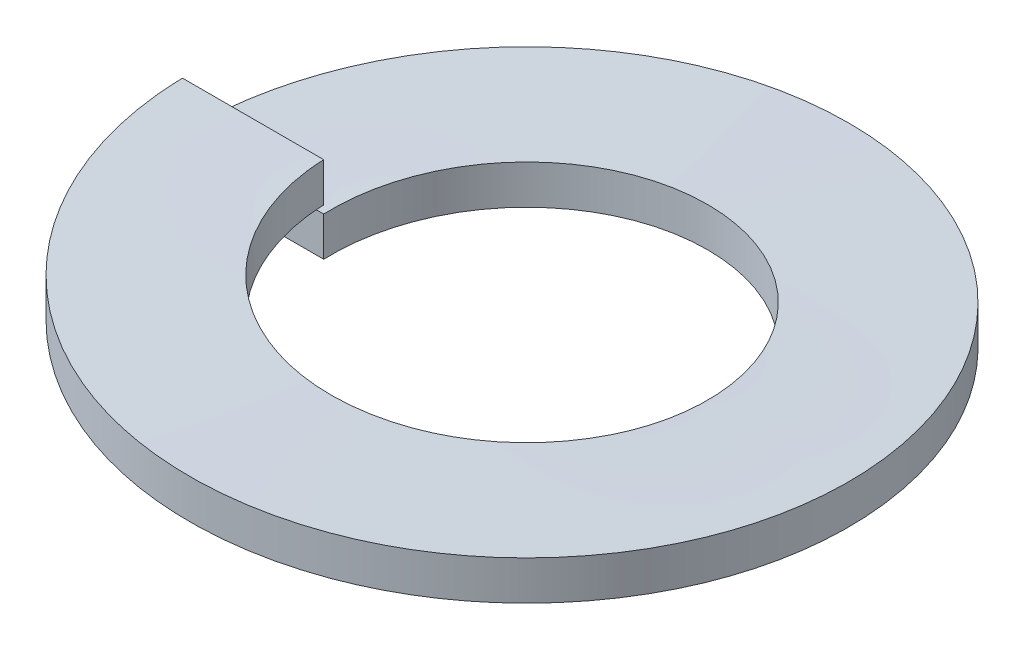
ISO-10303-21;
HEADER;
FILE_DESCRIPTION(('STEP AP214'),'2;1');
FILE_NAME('part.step','',(''),(''),'','','');
FILE_SCHEMA(('AUTOMOTIVE_DESIGN { 1 0 10303 214 1 1 1 1 }'));
ENDSEC;
DATA;
#1=APPLICATION_CONTEXT('core data for automotive mechanical design processes');
#2=APPLICATION_PROTOCOL_DEFINITION('international standard','automotive_design',2000,#1);
#3=PRODUCT_CONTEXT('',#1,'mechanical');
#4=PRODUCT('Part','Part','',(#3));
#5=PRODUCT_RELATED_PRODUCT_CATEGORY('part','',(#4));
#6=PRODUCT_DEFINITION_FORMATION('','',#4);
#7=PRODUCT_DEFINITION_CONTEXT('part definition',#1,'design');
#8=PRODUCT_DEFINITION('design','',#6,#7);
#9=PRODUCT_DEFINITION_SHAPE('','',#8);
#10=(LENGTH_UNIT() NAMED_UNIT(*) SI_UNIT(.MILLI.,.METRE.));
#11=(NAMED_UNIT(*) PLANE_ANGLE_UNIT() SI_UNIT($,.RADIAN.));
#12=(NAMED_UNIT(*) SI_UNIT($,.STERADIAN.) SOLID_ANGLE_UNIT());
#13=UNCERTAINTY_MEASURE_WITH_UNIT(LENGTH_MEASURE(1.E-05),#10,'distance_accuracy_value','');
#14=(GEOMETRIC_REPRESENTATION_CONTEXT(3) GLOBAL_UNCERTAINTY_ASSIGNED_CONTEXT((#13)) GLOBAL_UNIT_ASSIGNED_CONTEXT((#10,
#11,#12)) REPRESENTATION_CONTEXT('',''));
#15=CARTESIAN_POINT('',(0.,0.,0.));
#16=DIRECTION('',(0.,0.,1.));
#17=DIRECTION('',(1.,0.,0.));
#18=AXIS2_PLACEMENT_3D('',#15,#16,#17);
#19=CARTESIAN_POINT('',(-6.,0.625,0.));
#20=DIRECTION('',(0.,0.,1.));
#21=DIRECTION('',(1.,0.,0.));
#22=AXIS2_PLACEMENT_3D('',#19,#20,#21);
#23=PLANE('',#22);
#24=DIRECTION('',(0.,1.,0.));
#25=VECTOR('',#24,1.);
#26=CARTESIAN_POINT('',(-6.,0.625,0.));
#27=LINE('',#26,#25);
#28=CARTESIAN_POINT('',(-6.,0.,0.));
#29=VERTEX_POINT('',#28);
#30=CARTESIAN_POINT('',(-6.,1.25,0.));
#31=VERTEX_POINT('',#30);
#32=EDGE_CURVE('E56',#29,#31,#27,.T.);
#33=ORIENTED_EDGE('',*,*,#32,.T.);
#34=DIRECTION('',(-1.,0.,0.));
#35=VECTOR('',#34,1.);
#36=CARTESIAN_POINT('',(-8.25,1.25,0.));
#37=LINE('',#36,#35);
#38=CARTESIAN_POINT('',(-10.5,1.25,0.));
#39=VERTEX_POINT('',#38);
#40=EDGE_CURVE('E50',#31,#39,#37,.T.);
#41=ORIENTED_EDGE('',*,*,#40,.T.);
#42=DIRECTION('',(0.,-1.,0.));
#43=VECTOR('',#42,1.);
#44=CARTESIAN_POINT('',(-10.5,0.625,0.));
#45=LINE('',#44,#43);
#46=CARTESIAN_POINT('',(-10.5,0.,0.));
#47=VERTEX_POINT('',#46);
#48=EDGE_CURVE('E91',#39,#47,#45,.T.);
#49=ORIENTED_EDGE('',*,*,#48,.T.);
#50=DIRECTION('',(1.,0.,0.));
#51=VECTOR('',#50,1.);
#52=CARTESIAN_POINT('',(-8.25,0.,0.));
#53=LINE('',#52,#51);
#54=EDGE_CURVE('E72',#47,#29,#53,.T.);
#55=ORIENTED_EDGE('',*,*,#54,.T.);
#56=EDGE_LOOP('',(#33,#41,#49,#55));
#57=FACE_BOUND('',#56,.T.);
#58=ADVANCED_FACE('F46',(#57),#23,.T.);
#59=CARTESIAN_POINT('',(-6.,2.125,0.));
#60=DIRECTION('',(0.,0.,-1.));
#61=DIRECTION('',(-1.,0.,0.));
#62=AXIS2_PLACEMENT_3D('',#59,#60,#61);
#63=PLANE('',#62);
#64=DIRECTION('',(0.,-1.,0.));
#65=VECTOR('',#64,1.);
#66=CARTESIAN_POINT('',(-6.,2.125,0.));
#67=LINE('',#66,#65);
#68=CARTESIAN_POINT('',(-6.,2.75,0.));
#69=VERTEX_POINT('',#68);
#70=CARTESIAN_POINT('',(-6.,1.5,0.));
#71=VERTEX_POINT('',#70);
#72=EDGE_CURVE('E11',#69,#71,#67,.T.);
#73=ORIENTED_EDGE('',*,*,#72,.T.);
#74=DIRECTION('',(-1.,0.,0.));
#75=VECTOR('',#74,1.);
#76=CARTESIAN_POINT('',(-8.25,1.5,0.));
#77=LINE('',#76,#75);
#78=CARTESIAN_POINT('',(-10.5,1.5,0.));
#79=VERTEX_POINT('',#78);
#80=EDGE_CURVE('E217',#71,#79,#77,.T.);
#81=ORIENTED_EDGE('',*,*,#80,.T.);
#82=DIRECTION('',(0.,1.,0.));
#83=VECTOR('',#82,1.);
#84=CARTESIAN_POINT('',(-10.5,2.125,0.));
#85=LINE('',#84,#83);
#86=CARTESIAN_POINT('',(-10.5,2.75,0.));
#87=VERTEX_POINT('',#86);
#88=EDGE_CURVE('E113',#79,#87,#85,.T.);
#89=ORIENTED_EDGE('',*,*,#88,.T.);
#90=DIRECTION('',(1.,0.,0.));
#91=VECTOR('',#90,1.);
#92=CARTESIAN_POINT('',(-8.25,2.75,0.));
#93=LINE('',#92,#91);
#94=EDGE_CURVE('E97',#87,#69,#93,.T.);
#95=ORIENTED_EDGE('',*,*,#94,.T.);
#96=EDGE_LOOP('',(#73,#81,#89,#95));
#97=FACE_BOUND('',#96,.T.);
#98=ADVANCED_FACE('F48',(#97),#63,.T.);
#99=CARTESIAN_POINT('',(-6.,0.,0.));
#100=CARTESIAN_POINT('',(-6.,0.09375,-2.48528137423857));
#101=CARTESIAN_POINT('',(-4.24264068711929,0.1875,-4.24264068711929));
#102=CARTESIAN_POINT('',(-2.48528137423857,0.28125,-6.));
#103=CARTESIAN_POINT('',(0.,0.375,-6.));
#104=CARTESIAN_POINT('',(2.48528137423857,0.46875,-6.));
#105=CARTESIAN_POINT('',(4.24264068711929,0.5625,-4.24264068711929));
#106=CARTESIAN_POINT('',(6.,0.65625,-2.48528137423857));
#107=CARTESIAN_POINT('',(6.,0.75,0.));
#108=CARTESIAN_POINT('',(6.,0.84375,2.48528137423857));
#109=CARTESIAN_POINT('',(4.24264068711929,0.9375,4.24264068711929));
#110=CARTESIAN_POINT('',(2.48528137423857,1.03125,6.));
#111=CARTESIAN_POINT('',(0.,1.125,6.));
#112=CARTESIAN_POINT('',(-2.48528137423857,1.21875,6.));
#113=CARTESIAN_POINT('',(-4.24264068711928,1.3125,4.24264068711929));
#114=CARTESIAN_POINT('',(-6.,1.40625,2.48528137423857));
#115=CARTESIAN_POINT('',(-6.,1.5,0.));
#116=CARTESIAN_POINT('',(-6.,1.25,0.));
#117=CARTESIAN_POINT('',(-6.,1.34375,-2.48528137423857));
#118=CARTESIAN_POINT('',(-4.24264068711929,1.4375,-4.24264068711929));
#119=CARTESIAN_POINT('',(-2.48528137423857,1.53125,-6.));
#120=CARTESIAN_POINT('',(0.,1.625,-6.));
#121=CARTESIAN_POINT('',(2.48528137423857,1.71875,-6.));
#122=CARTESIAN_POINT('',(4.24264068711929,1.8125,-4.24264068711929));
#123=CARTESIAN_POINT('',(6.,1.90625,-2.48528137423857));
#124=CARTESIAN_POINT('',(6.,2.,0.));
#125=CARTESIAN_POINT('',(6.,2.09375,2.48528137423857));
#126=CARTESIAN_POINT('',(4.24264068711929,2.1875,4.24264068711929));
#127=CARTESIAN_POINT('',(2.48528137423857,2.28125,6.));
#128=CARTESIAN_POINT('',(0.,2.375,6.));
#129=CARTESIAN_POINT('',(-2.48528137423857,2.46875,6.));
#130=CARTESIAN_POINT('',(-4.24264068711928,2.5625,4.24264068711929));
#131=CARTESIAN_POINT('',(-6.,2.65625,2.48528137423857));
#132=CARTESIAN_POINT('',(-6.,2.75,0.));
#133=(BOUNDED_SURFACE() B_SPLINE_SURFACE(1,2,((#99,#100,#101,#102,#103,#104,#105,#106,#107,#108,
#109,#110,#111,#112,#113,#114,#115),(#116,#117,#118,#119,#120,#121,#122,#123,#124,#125,#126,
#127,#128,#129,#130,#131,#132)),.UNSPECIFIED.,.F.,.F.,.F.) B_SPLINE_SURFACE_WITH_KNOTS((2,2),(3,
2,2,2,2,2,2,2,3),(0.,1.),(0.,0.125,0.25,0.375,0.5,0.625,0.75,0.875,1.),
.UNSPECIFIED.) GEOMETRIC_REPRESENTATION_ITEM() RATIONAL_B_SPLINE_SURFACE(((1.,0.923879532511287,
1.,0.923879532511287,1.,0.923879532511287,1.,0.923879532511287,1.,0.923879532511287,1.,
0.923879532511287,1.,0.923879532511287,1.,0.923879532511287,1.),(1.,0.923879532511287,1.,
0.923879532511287,1.,0.923879532511287,1.,0.923879532511287,1.,0.923879532511287,1.,
0.923879532511287,1.,0.923879532511287,1.,0.923879532511287,1.))) REPRESENTATION_ITEM('') SURFACE());
#134=CARTESIAN_POINT('',(-6.,0.,0.));
#135=CARTESIAN_POINT('',(-6.,0.09375,-2.48528137423857));
#136=CARTESIAN_POINT('',(-4.24264068711929,0.1875,-4.24264068711929));
#137=CARTESIAN_POINT('',(-2.48528137423857,0.28125,-6.));
#138=CARTESIAN_POINT('',(0.,0.375,-6.));
#139=CARTESIAN_POINT('',(2.48528137423857,0.46875,-6.));
#140=CARTESIAN_POINT('',(4.24264068711929,0.5625,-4.24264068711929));
#141=CARTESIAN_POINT('',(6.,0.65625,-2.48528137423857));
#142=CARTESIAN_POINT('',(6.,0.75,0.));
#143=CARTESIAN_POINT('',(6.,0.84375,2.48528137423857));
#144=CARTESIAN_POINT('',(4.24264068711929,0.9375,4.24264068711929));
#145=CARTESIAN_POINT('',(2.48528137423857,1.03125,6.));
#146=CARTESIAN_POINT('',(0.,1.125,6.));
#147=CARTESIAN_POINT('',(-2.48528137423857,1.21875,6.));
#148=CARTESIAN_POINT('',(-4.24264068711928,1.3125,4.24264068711929));
#149=CARTESIAN_POINT('',(-6.,1.40625,2.48528137423857));
#150=CARTESIAN_POINT('',(-6.,1.5,0.));
#151=(BOUNDED_CURVE() B_SPLINE_CURVE(2,(#134,#135,#136,#137,#138,#139,#140,#141,#142,#143,#144,
#145,#146,#147,#148,#149,#150),.UNSPECIFIED.,.F.,.F.) B_SPLINE_CURVE_WITH_KNOTS((3,2,2,2,2,2,2,
2,3),(0.,0.125,0.25,0.375,0.5,0.625,0.75,0.875,1.),
.UNSPECIFIED.) CURVE() GEOMETRIC_REPRESENTATION_ITEM() RATIONAL_B_SPLINE_CURVE((1.,
0.923879532511287,1.,0.923879532511287,1.,0.923879532511287,1.,0.923879532511287,1.,
0.923879532511287,1.,0.923879532511287,1.,0.923879532511287,1.,0.923879532511287,1.)) REPRESENTATION_ITEM(''));
#152=EDGE_CURVE('E64',#29,#71,#151,.T.);
#153=CARTESIAN_POINT('',(-6.,1.25,0.));
#154=CARTESIAN_POINT('',(-6.,1.34375,-2.48528137423857));
#155=CARTESIAN_POINT('',(-4.24264068711929,1.4375,-4.24264068711929));
#156=CARTESIAN_POINT('',(-2.48528137423857,1.53125,-6.));
#157=CARTESIAN_POINT('',(0.,1.625,-6.));
#158=CARTESIAN_POINT('',(2.48528137423857,1.71875,-6.));
#159=CARTESIAN_POINT('',(4.24264068711929,1.8125,-4.24264068711929));
#160=CARTESIAN_POINT('',(6.,1.90625,-2.48528137423857));
#161=CARTESIAN_POINT('',(6.,2.,0.));
#162=CARTESIAN_POINT('',(6.,2.09375,2.48528137423857));
#163=CARTESIAN_POINT('',(4.24264068711929,2.1875,4.24264068711929));
#164=CARTESIAN_POINT('',(2.48528137423857,2.28125,6.));
#165=CARTESIAN_POINT('',(0.,2.375,6.));
#166=CARTESIAN_POINT('',(-2.48528137423857,2.46875,6.));
#167=CARTESIAN_POINT('',(-4.24264068711928,2.5625,4.24264068711929));
#168=CARTESIAN_POINT('',(-6.,2.65625,2.48528137423857));
#169=CARTESIAN_POINT('',(-6.,2.75,0.));
#170=(BOUNDED_CURVE() B_SPLINE_CURVE(2,(#153,#154,#155,#156,#157,#158,#159,#160,#161,#162,#163,
#164,#165,#166,#167,#168,#169),.UNSPECIFIED.,.F.,.F.) B_SPLINE_CURVE_WITH_KNOTS((3,2,2,2,2,2,2,
2,3),(0.,0.125,0.25,0.375,0.5,0.625,0.75,0.875,1.),
.UNSPECIFIED.) CURVE() GEOMETRIC_REPRESENTATION_ITEM() RATIONAL_B_SPLINE_CURVE((1.,
0.923879532511287,1.,0.923879532511287,1.,0.923879532511287,1.,0.923879532511287,1.,
0.923879532511287,1.,0.923879532511287,1.,0.923879532511287,1.,0.923879532511287,1.)) REPRESENTATION_ITEM(''));
#171=EDGE_CURVE('E105',#31,#69,#170,.T.);
#172=ORIENTED_EDGE('',*,*,#32,.F.);
#173=ORIENTED_EDGE('',*,*,#152,.T.);
#174=ORIENTED_EDGE('',*,*,#72,.F.);
#175=ORIENTED_EDGE('',*,*,#171,.F.);
#176=EDGE_LOOP('',(#172,#173,#174,#175));
#177=FACE_BOUND('',#176,.T.);
#178=ADVANCED_FACE('F121',(#177),#133,.F.);
#179=CARTESIAN_POINT('',(-10.5,0.,0.));
#180=CARTESIAN_POINT('',(-10.5,0.09375,-4.3492424049175));
#181=CARTESIAN_POINT('',(-7.42462120245875,0.1875,-7.42462120245875));
#182=CARTESIAN_POINT('',(-4.3492424049175,0.28125,-10.5));
#183=CARTESIAN_POINT('',(0.,0.375,-10.5));
#184=CARTESIAN_POINT('',(4.3492424049175,0.46875,-10.5));
#185=CARTESIAN_POINT('',(7.42462120245875,0.5625,-7.42462120245875));
#186=CARTESIAN_POINT('',(10.5,0.65625,-4.3492424049175));
#187=CARTESIAN_POINT('',(10.5,0.75,0.));
#188=CARTESIAN_POINT('',(10.5,0.84375,4.3492424049175));
#189=CARTESIAN_POINT('',(7.42462120245875,0.9375,7.42462120245875));
#190=CARTESIAN_POINT('',(4.3492424049175,1.03125,10.5));
#191=CARTESIAN_POINT('',(0.,1.125,10.5));
#192=CARTESIAN_POINT('',(-4.3492424049175,1.21875,10.5));
#193=CARTESIAN_POINT('',(-7.42462120245875,1.3125,7.42462120245875));
#194=CARTESIAN_POINT('',(-10.5,1.40625,4.34924240491751));
#195=CARTESIAN_POINT('',(-10.5,1.5,0.));
#196=CARTESIAN_POINT('',(-6.,0.,0.));
#197=CARTESIAN_POINT('',(-6.,0.09375,-2.48528137423857));
#198=CARTESIAN_POINT('',(-4.24264068711929,0.1875,-4.24264068711929));
#199=CARTESIAN_POINT('',(-2.48528137423857,0.28125,-6.));
#200=CARTESIAN_POINT('',(0.,0.375,-6.));
#201=CARTESIAN_POINT('',(2.48528137423857,0.46875,-6.));
#202=CARTESIAN_POINT('',(4.24264068711929,0.5625,-4.24264068711929));
#203=CARTESIAN_POINT('',(6.,0.65625,-2.48528137423857));
#204=CARTESIAN_POINT('',(6.,0.75,0.));
#205=CARTESIAN_POINT('',(6.,0.84375,2.48528137423857));
#206=CARTESIAN_POINT('',(4.24264068711929,0.9375,4.24264068711929));
#207=CARTESIAN_POINT('',(2.48528137423857,1.03125,6.));
#208=CARTESIAN_POINT('',(0.,1.125,6.));
#209=CARTESIAN_POINT('',(-2.48528137423857,1.21875,6.));
#210=CARTESIAN_POINT('',(-4.24264068711928,1.3125,4.24264068711929));
#211=CARTESIAN_POINT('',(-6.,1.40625,2.48528137423857));
#212=CARTESIAN_POINT('',(-6.,1.5,0.));
#213=(BOUNDED_SURFACE() B_SPLINE_SURFACE(1,2,((#179,#180,#181,#182,#183,#184,#185,#186,#187,
#188,#189,#190,#191,#192,#193,#194,#195),(#196,#197,#198,#199,#200,#201,#202,#203,#204,#205,
#206,#207,#208,#209,#210,#211,#212)),.UNSPECIFIED.,.F.,.F.,.F.) B_SPLINE_SURFACE_WITH_KNOTS((2,
2),(3,2,2,2,2,2,2,2,3),(0.,1.),(0.,0.125,0.25,0.375,0.5,0.625,0.75,0.875,1.),
.UNSPECIFIED.) GEOMETRIC_REPRESENTATION_ITEM() RATIONAL_B_SPLINE_SURFACE(((1.,0.923879532511287,
1.,0.923879532511287,1.,0.923879532511287,1.,0.923879532511287,1.,0.923879532511287,1.,
0.923879532511287,1.,0.923879532511287,1.,0.923879532511287,1.),(1.,0.923879532511287,1.,
0.923879532511287,1.,0.923879532511287,1.,0.923879532511287,1.,0.923879532511287,1.,
0.923879532511287,1.,0.923879532511287,1.,0.923879532511287,1.))) REPRESENTATION_ITEM('') SURFACE());
#214=CARTESIAN_POINT('',(-10.5,0.,0.));
#215=CARTESIAN_POINT('',(-10.5,0.09375,-4.3492424049175));
#216=CARTESIAN_POINT('',(-7.42462120245875,0.1875,-7.42462120245875));
#217=CARTESIAN_POINT('',(-4.3492424049175,0.28125,-10.5));
#218=CARTESIAN_POINT('',(0.,0.375,-10.5));
#219=CARTESIAN_POINT('',(4.3492424049175,0.46875,-10.5));
#220=CARTESIAN_POINT('',(7.42462120245875,0.5625,-7.42462120245875));
#221=CARTESIAN_POINT('',(10.5,0.65625,-4.3492424049175));
#222=CARTESIAN_POINT('',(10.5,0.75,0.));
#223=CARTESIAN_POINT('',(10.5,0.84375,4.3492424049175));
#224=CARTESIAN_POINT('',(7.42462120245875,0.9375,7.42462120245875));
#225=CARTESIAN_POINT('',(4.3492424049175,1.03125,10.5));
#226=CARTESIAN_POINT('',(0.,1.125,10.5));
#227=CARTESIAN_POINT('',(-4.3492424049175,1.21875,10.5));
#228=CARTESIAN_POINT('',(-7.42462120245875,1.3125,7.42462120245875));
#229=CARTESIAN_POINT('',(-10.5,1.40625,4.34924240491751));
#230=CARTESIAN_POINT('',(-10.5,1.5,0.));
#231=(BOUNDED_CURVE() B_SPLINE_CURVE(2,(#214,#215,#216,#217,#218,#219,#220,#221,#222,#223,#224,
#225,#226,#227,#228,#229,#230),.UNSPECIFIED.,.F.,.F.) B_SPLINE_CURVE_WITH_KNOTS((3,2,2,2,2,2,2,
2,3),(0.,0.125,0.25,0.375,0.5,0.625,0.75,0.875,1.),
.UNSPECIFIED.) CURVE() GEOMETRIC_REPRESENTATION_ITEM() RATIONAL_B_SPLINE_CURVE((1.,
0.923879532511287,1.,0.923879532511287,1.,0.923879532511287,1.,0.923879532511287,1.,
0.923879532511287,1.,0.923879532511287,1.,0.923879532511287,1.,0.923879532511287,1.)) REPRESENTATION_ITEM(''));
#232=EDGE_CURVE('E108',#47,#79,#231,.T.);
#233=ORIENTED_EDGE('',*,*,#54,.F.);
#234=ORIENTED_EDGE('',*,*,#232,.T.);
#235=ORIENTED_EDGE('',*,*,#80,.F.);
#236=ORIENTED_EDGE('',*,*,#152,.F.);
#237=EDGE_LOOP('',(#233,#234,#235,#236));
#238=FACE_BOUND('',#237,.T.);
#239=ADVANCED_FACE('F123',(#238),#213,.F.);
#240=CARTESIAN_POINT('',(-10.5,1.25,0.));
#241=CARTESIAN_POINT('',(-10.5,1.34375,-4.3492424049175));
#242=CARTESIAN_POINT('',(-7.42462120245875,1.4375,-7.42462120245875));
#243=CARTESIAN_POINT('',(-4.3492424049175,1.53125,-10.5));
#244=CARTESIAN_POINT('',(0.,1.625,-10.5));
#245=CARTESIAN_POINT('',(4.3492424049175,1.71875,-10.5));
#246=CARTESIAN_POINT('',(7.42462120245875,1.8125,-7.42462120245875));
#247=CARTESIAN_POINT('',(10.5,1.90625,-4.3492424049175));
#248=CARTESIAN_POINT('',(10.5,2.,0.));
#249=CARTESIAN_POINT('',(10.5,2.09375,4.3492424049175));
#250=CARTESIAN_POINT('',(7.42462120245875,2.1875,7.42462120245875));
#251=CARTESIAN_POINT('',(4.3492424049175,2.28125,10.5));
#252=CARTESIAN_POINT('',(0.,2.375,10.5));
#253=CARTESIAN_POINT('',(-4.3492424049175,2.46875,10.5));
#254=CARTESIAN_POINT('',(-7.42462120245875,2.5625,7.42462120245875));
#255=CARTESIAN_POINT('',(-10.5,2.65625,4.34924240491751));
#256=CARTESIAN_POINT('',(-10.5,2.75,0.));
#257=CARTESIAN_POINT('',(-10.5,0.,0.));
#258=CARTESIAN_POINT('',(-10.5,0.09375,-4.3492424049175));
#259=CARTESIAN_POINT('',(-7.42462120245875,0.1875,-7.42462120245875));
#260=CARTESIAN_POINT('',(-4.3492424049175,0.28125,-10.5));
#261=CARTESIAN_POINT('',(0.,0.375,-10.5));
#262=CARTESIAN_POINT('',(4.3492424049175,0.46875,-10.5));
#263=CARTESIAN_POINT('',(7.42462120245875,0.5625,-7.42462120245875));
#264=CARTESIAN_POINT('',(10.5,0.65625,-4.3492424049175));
#265=CARTESIAN_POINT('',(10.5,0.75,0.));
#266=CARTESIAN_POINT('',(10.5,0.84375,4.3492424049175));
#267=CARTESIAN_POINT('',(7.42462120245875,0.9375,7.42462120245875));
#268=CARTESIAN_POINT('',(4.3492424049175,1.03125,10.5));
#269=CARTESIAN_POINT('',(0.,1.125,10.5));
#270=CARTESIAN_POINT('',(-4.3492424049175,1.21875,10.5));
#271=CARTESIAN_POINT('',(-7.42462120245875,1.3125,7.42462120245875));
#272=CARTESIAN_POINT('',(-10.5,1.40625,4.34924240491751));
#273=CARTESIAN_POINT('',(-10.5,1.5,0.));
#274=(BOUNDED_SURFACE() B_SPLINE_SURFACE(1,2,((#240,#241,#242,#243,#244,#245,#246,#247,#248,
#249,#250,#251,#252,#253,#254,#255,#256),(#257,#258,#259,#260,#261,#262,#263,#264,#265,#266,
#267,#268,#269,#270,#271,#272,#273)),.UNSPECIFIED.,.F.,.F.,.F.) B_SPLINE_SURFACE_WITH_KNOTS((2,
2),(3,2,2,2,2,2,2,2,3),(0.,1.),(0.,0.125,0.25,0.375,0.5,0.625,0.75,0.875,1.),
.UNSPECIFIED.) GEOMETRIC_REPRESENTATION_ITEM() RATIONAL_B_SPLINE_SURFACE(((1.,0.923879532511287,
1.,0.923879532511287,1.,0.923879532511287,1.,0.923879532511287,1.,0.923879532511287,1.,
0.923879532511287,1.,0.923879532511287,1.,0.923879532511287,1.),(1.,0.923879532511287,1.,
0.923879532511287,1.,0.923879532511287,1.,0.923879532511287,1.,0.923879532511287,1.,
0.923879532511287,1.,0.923879532511287,1.,0.923879532511287,1.))) REPRESENTATION_ITEM('') SURFACE());
#275=CARTESIAN_POINT('',(-10.5,1.25,0.));
#276=CARTESIAN_POINT('',(-10.5,1.34375,-4.3492424049175));
#277=CARTESIAN_POINT('',(-7.42462120245875,1.4375,-7.42462120245875));
#278=CARTESIAN_POINT('',(-4.3492424049175,1.53125,-10.5));
#279=CARTESIAN_POINT('',(0.,1.625,-10.5));
#280=CARTESIAN_POINT('',(4.3492424049175,1.71875,-10.5));
#281=CARTESIAN_POINT('',(7.42462120245875,1.8125,-7.42462120245875));
#282=CARTESIAN_POINT('',(10.5,1.90625,-4.3492424049175));
#283=CARTESIAN_POINT('',(10.5,2.,0.));
#284=CARTESIAN_POINT('',(10.5,2.09375,4.3492424049175));
#285=CARTESIAN_POINT('',(7.42462120245875,2.1875,7.42462120245875));
#286=CARTESIAN_POINT('',(4.3492424049175,2.28125,10.5));
#287=CARTESIAN_POINT('',(0.,2.375,10.5));
#288=CARTESIAN_POINT('',(-4.3492424049175,2.46875,10.5));
#289=CARTESIAN_POINT('',(-7.42462120245875,2.5625,7.42462120245875));
#290=CARTESIAN_POINT('',(-10.5,2.65625,4.34924240491751));
#291=CARTESIAN_POINT('',(-10.5,2.75,0.));
#292=(BOUNDED_CURVE() B_SPLINE_CURVE(2,(#275,#276,#277,#278,#279,#280,#281,#282,#283,#284,#285,
#286,#287,#288,#289,#290,#291),.UNSPECIFIED.,.F.,.F.) B_SPLINE_CURVE_WITH_KNOTS((3,2,2,2,2,2,2,
2,3),(0.,0.125,0.25,0.375,0.5,0.625,0.75,0.875,1.),
.UNSPECIFIED.) CURVE() GEOMETRIC_REPRESENTATION_ITEM() RATIONAL_B_SPLINE_CURVE((1.,
0.923879532511287,1.,0.923879532511287,1.,0.923879532511287,1.,0.923879532511287,1.,
0.923879532511287,1.,0.923879532511287,1.,0.923879532511287,1.,0.923879532511287,1.)) REPRESENTATION_ITEM(''));
#293=EDGE_CURVE('E99',#39,#87,#292,.T.);
#294=ORIENTED_EDGE('',*,*,#48,.F.);
#295=ORIENTED_EDGE('',*,*,#293,.T.);
#296=ORIENTED_EDGE('',*,*,#88,.F.);
#297=ORIENTED_EDGE('',*,*,#232,.F.);
#298=EDGE_LOOP('',(#294,#295,#296,#297));
#299=FACE_BOUND('',#298,.T.);
#300=ADVANCED_FACE('F107',(#299),#274,.F.);
#301=CARTESIAN_POINT('',(-6.,1.25,0.));
#302=CARTESIAN_POINT('',(-6.,1.34375,-2.48528137423857));
#303=CARTESIAN_POINT('',(-4.24264068711929,1.4375,-4.24264068711929));
#304=CARTESIAN_POINT('',(-2.48528137423857,1.53125,-6.));
#305=CARTESIAN_POINT('',(0.,1.625,-6.));
#306=CARTESIAN_POINT('',(2.48528137423857,1.71875,-6.));
#307=CARTESIAN_POINT('',(4.24264068711929,1.8125,-4.24264068711929));
#308=CARTESIAN_POINT('',(6.,1.90625,-2.48528137423857));
#309=CARTESIAN_POINT('',(6.,2.,0.));
#310=CARTESIAN_POINT('',(6.,2.09375,2.48528137423857));
#311=CARTESIAN_POINT('',(4.24264068711929,2.1875,4.24264068711929));
#312=CARTESIAN_POINT('',(2.48528137423857,2.28125,6.));
#313=CARTESIAN_POINT('',(0.,2.375,6.));
#314=CARTESIAN_POINT('',(-2.48528137423857,2.46875,6.));
#315=CARTESIAN_POINT('',(-4.24264068711928,2.5625,4.24264068711929));
#316=CARTESIAN_POINT('',(-6.,2.65625,2.48528137423857));
#317=CARTESIAN_POINT('',(-6.,2.75,0.));
#318=CARTESIAN_POINT('',(-10.5,1.25,0.));
#319=CARTESIAN_POINT('',(-10.5,1.34375,-4.3492424049175));
#320=CARTESIAN_POINT('',(-7.42462120245875,1.4375,-7.42462120245875));
#321=CARTESIAN_POINT('',(-4.3492424049175,1.53125,-10.5));
#322=CARTESIAN_POINT('',(0.,1.625,-10.5));
#323=CARTESIAN_POINT('',(4.3492424049175,1.71875,-10.5));
#324=CARTESIAN_POINT('',(7.42462120245875,1.8125,-7.42462120245875));
#325=CARTESIAN_POINT('',(10.5,1.90625,-4.3492424049175));
#326=CARTESIAN_POINT('',(10.5,2.,0.));
#327=CARTESIAN_POINT('',(10.5,2.09375,4.3492424049175));
#328=CARTESIAN_POINT('',(7.42462120245875,2.1875,7.42462120245875));
#329=CARTESIAN_POINT('',(4.3492424049175,2.28125,10.5));
#330=CARTESIAN_POINT('',(0.,2.375,10.5));
#331=CARTESIAN_POINT('',(-4.3492424049175,2.46875,10.5));
#332=CARTESIAN_POINT('',(-7.42462120245875,2.5625,7.42462120245875));
#333=CARTESIAN_POINT('',(-10.5,2.65625,4.34924240491751));
#334=CARTESIAN_POINT('',(-10.5,2.75,0.));
#335=(BOUNDED_SURFACE() B_SPLINE_SURFACE(1,2,((#301,#302,#303,#304,#305,#306,#307,#308,#309,
#310,#311,#312,#313,#314,#315,#316,#317),(#318,#319,#320,#321,#322,#323,#324,#325,#326,#327,
#328,#329,#330,#331,#332,#333,#334)),.UNSPECIFIED.,.F.,.F.,.F.) B_SPLINE_SURFACE_WITH_KNOTS((2,
2),(3,2,2,2,2,2,2,2,3),(0.,1.),(0.,0.125,0.25,0.375,0.5,0.625,0.75,0.875,1.),
.UNSPECIFIED.) GEOMETRIC_REPRESENTATION_ITEM() RATIONAL_B_SPLINE_SURFACE(((1.,0.923879532511287,
1.,0.923879532511287,1.,0.923879532511287,1.,0.923879532511287,1.,0.923879532511287,1.,
0.923879532511287,1.,0.923879532511287,1.,0.923879532511287,1.),(1.,0.923879532511287,1.,
0.923879532511287,1.,0.923879532511287,1.,0.923879532511287,1.,0.923879532511287,1.,
0.923879532511287,1.,0.923879532511287,1.,0.923879532511287,1.))) REPRESENTATION_ITEM('') SURFACE());
#336=ORIENTED_EDGE('',*,*,#40,.F.);
#337=ORIENTED_EDGE('',*,*,#171,.T.);
#338=ORIENTED_EDGE('',*,*,#94,.F.);
#339=ORIENTED_EDGE('',*,*,#293,.F.);
#340=EDGE_LOOP('',(#336,#337,#338,#339));
#341=FACE_BOUND('',#340,.T.);
#342=ADVANCED_FACE('F100',(#341),#335,.F.);
#343=CLOSED_SHELL('',(#58,#98,#178,#239,#300,#342));
#344=MANIFOLD_SOLID_BREP('B2',#343);
#345=ADVANCED_BREP_SHAPE_REPRESENTATION('',(#18,#344),#14);
#346=SHAPE_DEFINITION_REPRESENTATION(#9,#345);
ENDSEC;
END-ISO-10303-21;
